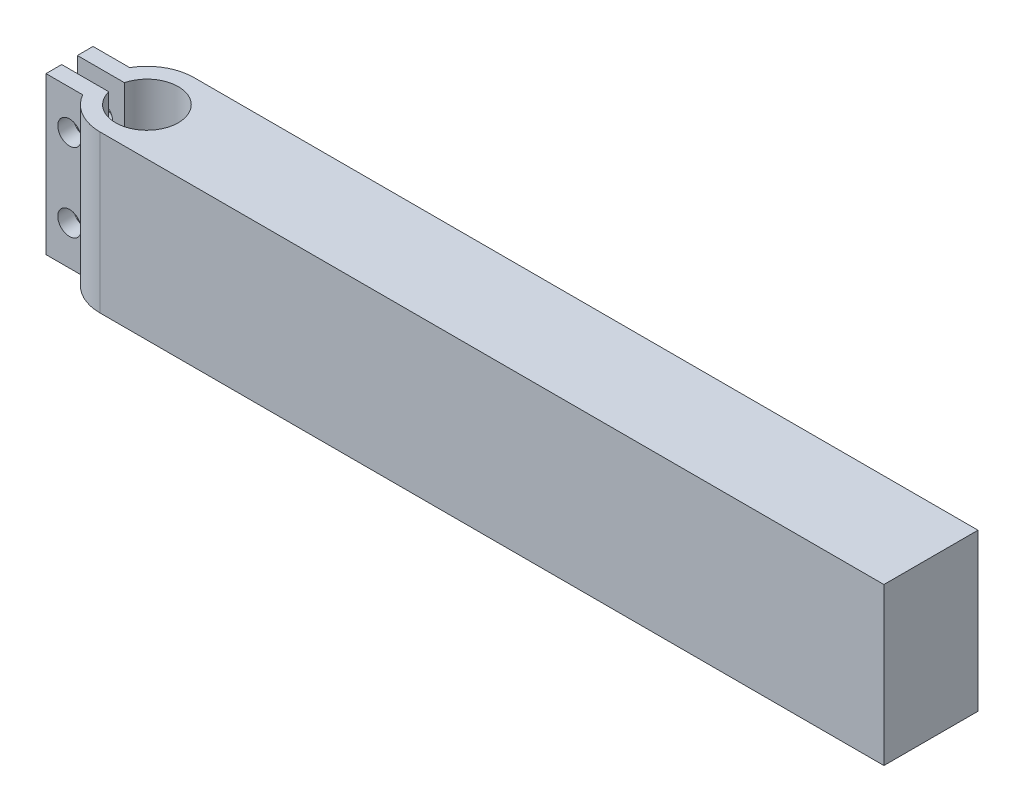
ISO-10303-21;
HEADER;
FILE_DESCRIPTION(('STEP AP214'),'2;1');
FILE_NAME('part.step','',(''),(''),'','','');
FILE_SCHEMA(('AUTOMOTIVE_DESIGN { 1 0 10303 214 1 1 1 1 }'));
ENDSEC;
DATA;
#1=APPLICATION_CONTEXT('core data for automotive mechanical design processes');
#2=APPLICATION_PROTOCOL_DEFINITION('international standard','automotive_design',2000,#1);
#3=PRODUCT_CONTEXT('',#1,'mechanical');
#4=PRODUCT('Part','Part','',(#3));
#5=PRODUCT_RELATED_PRODUCT_CATEGORY('part','',(#4));
#6=PRODUCT_DEFINITION_FORMATION('','',#4);
#7=PRODUCT_DEFINITION_CONTEXT('part definition',#1,'design');
#8=PRODUCT_DEFINITION('design','',#6,#7);
#9=PRODUCT_DEFINITION_SHAPE('','',#8);
#10=(LENGTH_UNIT() NAMED_UNIT(*) SI_UNIT(.MILLI.,.METRE.));
#11=(NAMED_UNIT(*) PLANE_ANGLE_UNIT() SI_UNIT($,.RADIAN.));
#12=(NAMED_UNIT(*) SI_UNIT($,.STERADIAN.) SOLID_ANGLE_UNIT());
#13=UNCERTAINTY_MEASURE_WITH_UNIT(LENGTH_MEASURE(1.E-05),#10,'distance_accuracy_value','');
#14=(GEOMETRIC_REPRESENTATION_CONTEXT(3) GLOBAL_UNCERTAINTY_ASSIGNED_CONTEXT((#13)) GLOBAL_UNIT_ASSIGNED_CONTEXT((#10,
#11,#12)) REPRESENTATION_CONTEXT('',''));
#15=CARTESIAN_POINT('',(0.,0.,0.));
#16=DIRECTION('',(0.,0.,1.));
#17=DIRECTION('',(1.,0.,0.));
#18=AXIS2_PLACEMENT_3D('',#15,#16,#17);
#19=CARTESIAN_POINT('',(0.,20.,-6.));
#20=DIRECTION('',(0.,-1.,0.));
#21=DIRECTION('',(0.,0.,-1.));
#22=AXIS2_PLACEMENT_3D('',#19,#20,#21);
#23=CYLINDRICAL_SURFACE('',#22,6.);
#24=CARTESIAN_POINT('',(0.,20.,-6.));
#25=DIRECTION('',(0.,1.,0.));
#26=DIRECTION('',(0.,0.,1.));
#27=AXIS2_PLACEMENT_3D('',#24,#25,#26);
#28=CIRCLE('',#27,6.);
#29=CARTESIAN_POINT('',(-5.19615242270663,20.,-3.));
#30=VERTEX_POINT('',#29);
#31=CARTESIAN_POINT('',(0.,20.,0.));
#32=VERTEX_POINT('',#31);
#33=EDGE_CURVE('E188',#30,#32,#28,.T.);
#34=ORIENTED_EDGE('',*,*,#33,.F.);
#35=DIRECTION('',(0.,-1.,0.));
#36=VECTOR('',#35,1.);
#37=CARTESIAN_POINT('',(-5.19615242270663,20.,-3.));
#38=LINE('',#37,#36);
#39=CARTESIAN_POINT('',(-5.19615242270663,0.,-3.));
#40=VERTEX_POINT('',#39);
#41=EDGE_CURVE('E153',#30,#40,#38,.T.);
#42=ORIENTED_EDGE('',*,*,#41,.T.);
#43=CARTESIAN_POINT('',(0.,0.,-6.));
#44=DIRECTION('',(0.,1.,0.));
#45=DIRECTION('',(0.,0.,1.));
#46=AXIS2_PLACEMENT_3D('',#43,#44,#45);
#47=CIRCLE('',#46,6.);
#48=CARTESIAN_POINT('',(0.,0.,0.));
#49=VERTEX_POINT('',#48);
#50=EDGE_CURVE('E200',#40,#49,#47,.T.);
#51=ORIENTED_EDGE('',*,*,#50,.T.);
#52=DIRECTION('',(0.,-1.,0.));
#53=VECTOR('',#52,1.);
#54=CARTESIAN_POINT('',(0.,20.,0.));
#55=LINE('',#54,#53);
#56=EDGE_CURVE('E212',#32,#49,#55,.T.);
#57=ORIENTED_EDGE('',*,*,#56,.F.);
#58=EDGE_LOOP('',(#34,#42,#51,#57));
#59=FACE_BOUND('',#58,.T.);
#60=ADVANCED_FACE('F35',(#59),#23,.T.);
#61=CARTESIAN_POINT('',(0.,20.,-12.));
#62=DIRECTION('',(0.,0.,-1.));
#63=DIRECTION('',(-1.,0.,0.));
#64=AXIS2_PLACEMENT_3D('',#61,#62,#63);
#65=PLANE('',#64);
#66=DIRECTION('',(1.,0.,0.));
#67=VECTOR('',#66,1.);
#68=CARTESIAN_POINT('',(0.,0.,-12.));
#69=LINE('',#68,#67);
#70=CARTESIAN_POINT('',(0.,0.,-12.));
#71=VERTEX_POINT('',#70);
#72=CARTESIAN_POINT('',(100.,0.,-12.));
#73=VERTEX_POINT('',#72);
#74=EDGE_CURVE('E182',#71,#73,#69,.T.);
#75=ORIENTED_EDGE('',*,*,#74,.F.);
#76=DIRECTION('',(0.,-1.,0.));
#77=VECTOR('',#76,1.);
#78=CARTESIAN_POINT('',(0.,20.,-12.));
#79=LINE('',#78,#77);
#80=CARTESIAN_POINT('',(0.,20.,-12.));
#81=VERTEX_POINT('',#80);
#82=EDGE_CURVE('E215',#81,#71,#79,.T.);
#83=ORIENTED_EDGE('',*,*,#82,.F.);
#84=DIRECTION('',(1.,0.,0.));
#85=VECTOR('',#84,1.);
#86=CARTESIAN_POINT('',(0.,20.,-12.));
#87=LINE('',#86,#85);
#88=CARTESIAN_POINT('',(100.,20.,-12.));
#89=VERTEX_POINT('',#88);
#90=EDGE_CURVE('E185',#81,#89,#87,.T.);
#91=ORIENTED_EDGE('',*,*,#90,.T.);
#92=DIRECTION('',(0.,-1.,0.));
#93=VECTOR('',#92,1.);
#94=CARTESIAN_POINT('',(100.,20.,-12.));
#95=LINE('',#94,#93);
#96=EDGE_CURVE('E197',#89,#73,#95,.T.);
#97=ORIENTED_EDGE('',*,*,#96,.T.);
#98=EDGE_LOOP('',(#75,#83,#91,#97));
#99=FACE_BOUND('',#98,.T.);
#100=ADVANCED_FACE('F37',(#99),#65,.T.);
#101=CARTESIAN_POINT('',(-5.19615242270663,0.,-9.));
#102=VERTEX_POINT('',#101);
#103=EDGE_CURVE('E201',#71,#102,#47,.T.);
#104=ORIENTED_EDGE('',*,*,#103,.T.);
#105=DIRECTION('',(0.,-1.,0.));
#106=VECTOR('',#105,1.);
#107=CARTESIAN_POINT('',(-5.19615242270663,20.,-9.));
#108=LINE('',#107,#106);
#109=CARTESIAN_POINT('',(-5.19615242270663,20.,-9.));
#110=VERTEX_POINT('',#109);
#111=EDGE_CURVE('E171',#102,#110,#108,.F.);
#112=ORIENTED_EDGE('',*,*,#111,.T.);
#113=EDGE_CURVE('E190',#81,#110,#28,.T.);
#114=ORIENTED_EDGE('',*,*,#113,.F.);
#115=ORIENTED_EDGE('',*,*,#82,.T.);
#116=EDGE_LOOP('',(#104,#112,#114,#115));
#117=FACE_BOUND('',#116,.T.);
#118=ADVANCED_FACE('F235',(#117),#23,.T.);
#119=CARTESIAN_POINT('',(0.,20.,0.));
#120=DIRECTION('',(0.,0.,-1.));
#121=DIRECTION('',(-1.,0.,0.));
#122=AXIS2_PLACEMENT_3D('',#119,#120,#121);
#123=PLANE('',#122);
#124=DIRECTION('',(1.,0.,0.));
#125=VECTOR('',#124,1.);
#126=CARTESIAN_POINT('',(0.,0.,0.));
#127=LINE('',#126,#125);
#128=CARTESIAN_POINT('',(100.,0.,0.));
#129=VERTEX_POINT('',#128);
#130=EDGE_CURVE('E204',#49,#129,#127,.T.);
#131=ORIENTED_EDGE('',*,*,#130,.T.);
#132=DIRECTION('',(0.,-1.,0.));
#133=VECTOR('',#132,1.);
#134=CARTESIAN_POINT('',(100.,20.,0.));
#135=LINE('',#134,#133);
#136=CARTESIAN_POINT('',(100.,20.,0.));
#137=VERTEX_POINT('',#136);
#138=EDGE_CURVE('E209',#137,#129,#135,.T.);
#139=ORIENTED_EDGE('',*,*,#138,.F.);
#140=DIRECTION('',(1.,0.,0.));
#141=VECTOR('',#140,1.);
#142=CARTESIAN_POINT('',(0.,20.,0.));
#143=LINE('',#142,#141);
#144=EDGE_CURVE('E193',#32,#137,#143,.T.);
#145=ORIENTED_EDGE('',*,*,#144,.F.);
#146=ORIENTED_EDGE('',*,*,#56,.T.);
#147=EDGE_LOOP('',(#131,#139,#145,#146));
#148=FACE_BOUND('',#147,.T.);
#149=ADVANCED_FACE('F248',(#148),#123,.F.);
#150=CARTESIAN_POINT('',(100.,20.,0.));
#151=DIRECTION('',(-1.,0.,0.));
#152=DIRECTION('',(0.,0.,1.));
#153=AXIS2_PLACEMENT_3D('',#150,#151,#152);
#154=PLANE('',#153);
#155=DIRECTION('',(0.,0.,-1.));
#156=VECTOR('',#155,1.);
#157=CARTESIAN_POINT('',(100.,0.,0.));
#158=LINE('',#157,#156);
#159=EDGE_CURVE('E189',#129,#73,#158,.T.);
#160=ORIENTED_EDGE('',*,*,#159,.T.);
#161=ORIENTED_EDGE('',*,*,#96,.F.);
#162=DIRECTION('',(0.,0.,-1.));
#163=VECTOR('',#162,1.);
#164=CARTESIAN_POINT('',(100.,20.,0.));
#165=LINE('',#164,#163);
#166=EDGE_CURVE('E195',#137,#89,#165,.T.);
#167=ORIENTED_EDGE('',*,*,#166,.F.);
#168=ORIENTED_EDGE('',*,*,#138,.T.);
#169=EDGE_LOOP('',(#160,#161,#167,#168));
#170=FACE_BOUND('',#169,.T.);
#171=ADVANCED_FACE('F243',(#170),#154,.F.);
#172=CARTESIAN_POINT('',(0.,20.,0.));
#173=DIRECTION('',(0.,1.,0.));
#174=DIRECTION('',(0.,0.,1.));
#175=AXIS2_PLACEMENT_3D('',#172,#173,#174);
#176=PLANE('',#175);
#177=CARTESIAN_POINT('',(0.,20.,-6.));
#178=DIRECTION('',(0.,1.,0.));
#179=DIRECTION('',(0.,0.,1.));
#180=AXIS2_PLACEMENT_3D('',#177,#178,#179);
#181=CIRCLE('',#180,4.);
#182=CARTESIAN_POINT('',(-3.87298334620742,20.,-5.));
#183=VERTEX_POINT('',#182);
#184=CARTESIAN_POINT('',(-3.87298334620742,20.,-7.));
#185=VERTEX_POINT('',#184);
#186=EDGE_CURVE('E131',#183,#185,#181,.T.);
#187=ORIENTED_EDGE('',*,*,#186,.F.);
#188=DIRECTION('',(1.,0.,0.));
#189=VECTOR('',#188,1.);
#190=CARTESIAN_POINT('',(-9.,20.,-5.));
#191=LINE('',#190,#189);
#192=CARTESIAN_POINT('',(-9.87298334620742,20.,-5.));
#193=VERTEX_POINT('',#192);
#194=EDGE_CURVE('E58',#193,#183,#191,.T.);
#195=ORIENTED_EDGE('',*,*,#194,.F.);
#196=DIRECTION('',(0.,0.,1.));
#197=VECTOR('',#196,1.);
#198=CARTESIAN_POINT('',(-9.87298334620742,20.,-5.));
#199=LINE('',#198,#197);
#200=CARTESIAN_POINT('',(-9.87298334620742,20.,-3.));
#201=VERTEX_POINT('',#200);
#202=EDGE_CURVE('E139',#193,#201,#199,.T.);
#203=ORIENTED_EDGE('',*,*,#202,.T.);
#204=DIRECTION('',(1.,0.,0.));
#205=VECTOR('',#204,1.);
#206=CARTESIAN_POINT('',(-3.87298334620742,20.,-3.));
#207=LINE('',#206,#205);
#208=EDGE_CURVE('E50',#201,#30,#207,.T.);
#209=ORIENTED_EDGE('',*,*,#208,.T.);
#210=ORIENTED_EDGE('',*,*,#33,.T.);
#211=ORIENTED_EDGE('',*,*,#144,.T.);
#212=ORIENTED_EDGE('',*,*,#166,.T.);
#213=ORIENTED_EDGE('',*,*,#90,.F.);
#214=ORIENTED_EDGE('',*,*,#113,.T.);
#215=DIRECTION('',(-1.,0.,0.));
#216=VECTOR('',#215,1.);
#217=CARTESIAN_POINT('',(-3.87298334620742,20.,-9.));
#218=LINE('',#217,#216);
#219=CARTESIAN_POINT('',(-9.87298334620742,20.,-9.));
#220=VERTEX_POINT('',#219);
#221=EDGE_CURVE('E157',#110,#220,#218,.T.);
#222=ORIENTED_EDGE('',*,*,#221,.T.);
#223=DIRECTION('',(0.,0.,1.));
#224=VECTOR('',#223,1.);
#225=CARTESIAN_POINT('',(-9.87298334620742,20.,-7.));
#226=LINE('',#225,#224);
#227=CARTESIAN_POINT('',(-9.87298334620742,20.,-7.));
#228=VERTEX_POINT('',#227);
#229=EDGE_CURVE('E161',#220,#228,#226,.T.);
#230=ORIENTED_EDGE('',*,*,#229,.T.);
#231=DIRECTION('',(-1.,0.,0.));
#232=VECTOR('',#231,1.);
#233=CARTESIAN_POINT('',(-9.,20.,-7.));
#234=LINE('',#233,#232);
#235=EDGE_CURVE('E176',#185,#228,#234,.T.);
#236=ORIENTED_EDGE('',*,*,#235,.F.);
#237=EDGE_LOOP('',(#187,#195,#203,#209,#210,#211,#212,#213,#214,#222,#230,#236));
#238=FACE_BOUND('',#237,.T.);
#239=ADVANCED_FACE('F254',(#238),#176,.T.);
#240=CARTESIAN_POINT('',(0.,0.,0.));
#241=DIRECTION('',(0.,1.,0.));
#242=DIRECTION('',(0.,0.,1.));
#243=AXIS2_PLACEMENT_3D('',#240,#241,#242);
#244=PLANE('',#243);
#245=DIRECTION('',(1.,0.,0.));
#246=VECTOR('',#245,1.);
#247=CARTESIAN_POINT('',(-9.,0.,-5.));
#248=LINE('',#247,#246);
#249=CARTESIAN_POINT('',(-9.87298334620742,0.,-5.));
#250=VERTEX_POINT('',#249);
#251=CARTESIAN_POINT('',(-3.87298334620742,0.,-5.));
#252=VERTEX_POINT('',#251);
#253=EDGE_CURVE('E122',#250,#252,#248,.T.);
#254=ORIENTED_EDGE('',*,*,#253,.T.);
#255=CARTESIAN_POINT('',(0.,0.,-6.));
#256=DIRECTION('',(0.,1.,0.));
#257=DIRECTION('',(0.,0.,1.));
#258=AXIS2_PLACEMENT_3D('',#255,#256,#257);
#259=CIRCLE('',#258,4.);
#260=CARTESIAN_POINT('',(-3.87298334620742,0.,-7.));
#261=VERTEX_POINT('',#260);
#262=EDGE_CURVE('E180',#252,#261,#259,.T.);
#263=ORIENTED_EDGE('',*,*,#262,.T.);
#264=DIRECTION('',(-1.,0.,0.));
#265=VECTOR('',#264,1.);
#266=CARTESIAN_POINT('',(-9.,0.,-7.));
#267=LINE('',#266,#265);
#268=CARTESIAN_POINT('',(-9.87298334620742,0.,-7.));
#269=VERTEX_POINT('',#268);
#270=EDGE_CURVE('E132',#261,#269,#267,.T.);
#271=ORIENTED_EDGE('',*,*,#270,.T.);
#272=DIRECTION('',(0.,0.,1.));
#273=VECTOR('',#272,1.);
#274=CARTESIAN_POINT('',(-9.87298334620742,0.,-7.));
#275=LINE('',#274,#273);
#276=CARTESIAN_POINT('',(-9.87298334620742,0.,-9.));
#277=VERTEX_POINT('',#276);
#278=EDGE_CURVE('E160',#277,#269,#275,.T.);
#279=ORIENTED_EDGE('',*,*,#278,.F.);
#280=DIRECTION('',(-1.,0.,0.));
#281=VECTOR('',#280,1.);
#282=CARTESIAN_POINT('',(-3.87298334620742,0.,-9.));
#283=LINE('',#282,#281);
#284=EDGE_CURVE('E158',#102,#277,#283,.T.);
#285=ORIENTED_EDGE('',*,*,#284,.F.);
#286=ORIENTED_EDGE('',*,*,#103,.F.);
#287=ORIENTED_EDGE('',*,*,#74,.T.);
#288=ORIENTED_EDGE('',*,*,#159,.F.);
#289=ORIENTED_EDGE('',*,*,#130,.F.);
#290=ORIENTED_EDGE('',*,*,#50,.F.);
#291=DIRECTION('',(1.,0.,0.));
#292=VECTOR('',#291,1.);
#293=CARTESIAN_POINT('',(-3.87298334620742,0.,-3.));
#294=LINE('',#293,#292);
#295=CARTESIAN_POINT('',(-9.87298334620742,0.,-3.));
#296=VERTEX_POINT('',#295);
#297=EDGE_CURVE('E141',#296,#40,#294,.T.);
#298=ORIENTED_EDGE('',*,*,#297,.F.);
#299=DIRECTION('',(0.,0.,1.));
#300=VECTOR('',#299,1.);
#301=CARTESIAN_POINT('',(-9.87298334620742,0.,-5.));
#302=LINE('',#301,#300);
#303=EDGE_CURVE('E137',#250,#296,#302,.T.);
#304=ORIENTED_EDGE('',*,*,#303,.F.);
#305=EDGE_LOOP('',(#254,#263,#271,#279,#285,#286,#287,#288,#289,#290,#298,#304));
#306=FACE_BOUND('',#305,.T.);
#307=ADVANCED_FACE('F143',(#306),#244,.F.);
#308=CARTESIAN_POINT('',(0.,0.,-6.));
#309=DIRECTION('',(0.,1.,0.));
#310=DIRECTION('',(0.,0.,1.));
#311=AXIS2_PLACEMENT_3D('',#308,#309,#310);
#312=CYLINDRICAL_SURFACE('',#311,4.);
#313=ORIENTED_EDGE('',*,*,#262,.F.);
#314=DIRECTION('',(0.,1.,0.));
#315=VECTOR('',#314,1.);
#316=CARTESIAN_POINT('',(-3.87298334620742,0.,-5.));
#317=LINE('',#316,#315);
#318=EDGE_CURVE('E11',#252,#183,#317,.T.);
#319=ORIENTED_EDGE('',*,*,#318,.T.);
#320=ORIENTED_EDGE('',*,*,#186,.T.);
#321=DIRECTION('',(0.,1.,0.));
#322=VECTOR('',#321,1.);
#323=CARTESIAN_POINT('',(-3.87298334620742,0.,-7.));
#324=LINE('',#323,#322);
#325=EDGE_CURVE('E43',#185,#261,#324,.F.);
#326=ORIENTED_EDGE('',*,*,#325,.T.);
#327=EDGE_LOOP('',(#313,#319,#320,#326));
#328=FACE_BOUND('',#327,.T.);
#329=ADVANCED_FACE('F218',(#328),#312,.F.);
#330=CARTESIAN_POINT('',(-9.,0.,-7.));
#331=DIRECTION('',(0.,0.,-1.));
#332=DIRECTION('',(-1.,0.,0.));
#333=AXIS2_PLACEMENT_3D('',#330,#331,#332);
#334=PLANE('',#333);
#335=CARTESIAN_POINT('',(-6.87298334620742,5.,-7.));
#336=DIRECTION('',(0.,0.,-1.));
#337=DIRECTION('',(-1.,0.,0.));
#338=AXIS2_PLACEMENT_3D('',#335,#336,#337);
#339=CIRCLE('',#338,1.5);
#340=CARTESIAN_POINT('',(-8.37298334620742,5.,-7.));
#341=VERTEX_POINT('',#340);
#342=EDGE_CURVE('E412',#341,#341,#339,.T.);
#343=ORIENTED_EDGE('',*,*,#342,.T.);
#344=EDGE_LOOP('',(#343));
#345=FACE_BOUND('',#344,.T.);
#346=CARTESIAN_POINT('',(-6.87298334620742,15.,-7.));
#347=DIRECTION('',(0.,0.,-1.));
#348=DIRECTION('',(-1.,0.,0.));
#349=AXIS2_PLACEMENT_3D('',#346,#347,#348);
#350=CIRCLE('',#349,1.5);
#351=CARTESIAN_POINT('',(-8.37298334620742,15.,-7.));
#352=VERTEX_POINT('',#351);
#353=EDGE_CURVE('E149',#352,#352,#350,.T.);
#354=ORIENTED_EDGE('',*,*,#353,.T.);
#355=EDGE_LOOP('',(#354));
#356=FACE_BOUND('',#355,.T.);
#357=ORIENTED_EDGE('',*,*,#270,.F.);
#358=ORIENTED_EDGE('',*,*,#325,.F.);
#359=ORIENTED_EDGE('',*,*,#235,.T.);
#360=DIRECTION('',(0.,1.,0.));
#361=VECTOR('',#360,1.);
#362=CARTESIAN_POINT('',(-9.87298334620742,0.,-7.));
#363=LINE('',#362,#361);
#364=EDGE_CURVE('E168',#269,#228,#363,.T.);
#365=ORIENTED_EDGE('',*,*,#364,.F.);
#366=EDGE_LOOP('',(#357,#358,#359,#365));
#367=FACE_BOUND('',#366,.T.);
#368=ADVANCED_FACE('F225',(#345,#356,#367),#334,.F.);
#369=CARTESIAN_POINT('',(-9.,0.,-5.));
#370=DIRECTION('',(0.,0.,1.));
#371=DIRECTION('',(1.,0.,0.));
#372=AXIS2_PLACEMENT_3D('',#369,#370,#371);
#373=PLANE('',#372);
#374=CARTESIAN_POINT('',(-6.87298334620742,5.,-5.));
#375=DIRECTION('',(0.,0.,1.));
#376=DIRECTION('',(1.,0.,0.));
#377=AXIS2_PLACEMENT_3D('',#374,#375,#376);
#378=CIRCLE('',#377,1.5);
#379=CARTESIAN_POINT('',(-5.37298334620742,5.,-5.));
#380=VERTEX_POINT('',#379);
#381=EDGE_CURVE('E414',#380,#380,#378,.T.);
#382=ORIENTED_EDGE('',*,*,#381,.T.);
#383=EDGE_LOOP('',(#382));
#384=FACE_BOUND('',#383,.T.);
#385=CARTESIAN_POINT('',(-6.87298334620742,15.,-5.));
#386=DIRECTION('',(0.,0.,1.));
#387=DIRECTION('',(1.,0.,0.));
#388=AXIS2_PLACEMENT_3D('',#385,#386,#387);
#389=CIRCLE('',#388,1.5);
#390=CARTESIAN_POINT('',(-5.37298334620742,15.,-5.));
#391=VERTEX_POINT('',#390);
#392=EDGE_CURVE('E424',#391,#391,#389,.T.);
#393=ORIENTED_EDGE('',*,*,#392,.T.);
#394=EDGE_LOOP('',(#393));
#395=FACE_BOUND('',#394,.T.);
#396=ORIENTED_EDGE('',*,*,#194,.T.);
#397=ORIENTED_EDGE('',*,*,#318,.F.);
#398=ORIENTED_EDGE('',*,*,#253,.F.);
#399=DIRECTION('',(0.,1.,0.));
#400=VECTOR('',#399,1.);
#401=CARTESIAN_POINT('',(-9.87298334620742,0.,-5.));
#402=LINE('',#401,#400);
#403=EDGE_CURVE('E125',#250,#193,#402,.T.);
#404=ORIENTED_EDGE('',*,*,#403,.T.);
#405=EDGE_LOOP('',(#396,#397,#398,#404));
#406=FACE_BOUND('',#405,.T.);
#407=ADVANCED_FACE('F124',(#384,#395,#406),#373,.F.);
#408=CARTESIAN_POINT('',(-3.87298334620742,0.,-9.));
#409=DIRECTION('',(0.,0.,-1.));
#410=DIRECTION('',(-1.,0.,0.));
#411=AXIS2_PLACEMENT_3D('',#408,#409,#410);
#412=PLANE('',#411);
#413=CARTESIAN_POINT('',(-6.87298334620742,5.,-9.));
#414=DIRECTION('',(0.,0.,-1.));
#415=DIRECTION('',(-1.,0.,0.));
#416=AXIS2_PLACEMENT_3D('',#413,#414,#415);
#417=CIRCLE('',#416,1.5);
#418=CARTESIAN_POINT('',(-8.37298334620742,5.,-9.));
#419=VERTEX_POINT('',#418);
#420=EDGE_CURVE('E409',#419,#419,#417,.T.);
#421=ORIENTED_EDGE('',*,*,#420,.F.);
#422=EDGE_LOOP('',(#421));
#423=FACE_BOUND('',#422,.T.);
#424=CARTESIAN_POINT('',(-6.87298334620742,15.,-9.));
#425=DIRECTION('',(0.,0.,-1.));
#426=DIRECTION('',(-1.,0.,0.));
#427=AXIS2_PLACEMENT_3D('',#424,#425,#426);
#428=CIRCLE('',#427,1.5);
#429=CARTESIAN_POINT('',(-8.37298334620742,15.,-9.));
#430=VERTEX_POINT('',#429);
#431=EDGE_CURVE('E417',#430,#430,#428,.T.);
#432=ORIENTED_EDGE('',*,*,#431,.F.);
#433=EDGE_LOOP('',(#432));
#434=FACE_BOUND('',#433,.T.);
#435=ORIENTED_EDGE('',*,*,#111,.F.);
#436=ORIENTED_EDGE('',*,*,#284,.T.);
#437=DIRECTION('',(0.,1.,0.));
#438=VECTOR('',#437,1.);
#439=CARTESIAN_POINT('',(-9.87298334620742,0.,-9.));
#440=LINE('',#439,#438);
#441=EDGE_CURVE('E164',#277,#220,#440,.T.);
#442=ORIENTED_EDGE('',*,*,#441,.T.);
#443=ORIENTED_EDGE('',*,*,#221,.F.);
#444=EDGE_LOOP('',(#435,#436,#442,#443));
#445=FACE_BOUND('',#444,.T.);
#446=ADVANCED_FACE('F231',(#423,#434,#445),#412,.T.);
#447=CARTESIAN_POINT('',(-9.87298334620742,0.,-7.));
#448=DIRECTION('',(-1.,0.,0.));
#449=DIRECTION('',(0.,0.,1.));
#450=AXIS2_PLACEMENT_3D('',#447,#448,#449);
#451=PLANE('',#450);
#452=ORIENTED_EDGE('',*,*,#229,.F.);
#453=ORIENTED_EDGE('',*,*,#441,.F.);
#454=ORIENTED_EDGE('',*,*,#278,.T.);
#455=ORIENTED_EDGE('',*,*,#364,.T.);
#456=EDGE_LOOP('',(#452,#453,#454,#455));
#457=FACE_BOUND('',#456,.T.);
#458=ADVANCED_FACE('F229',(#457),#451,.T.);
#459=CARTESIAN_POINT('',(-3.87298334620742,0.,-3.));
#460=DIRECTION('',(0.,0.,1.));
#461=DIRECTION('',(1.,0.,0.));
#462=AXIS2_PLACEMENT_3D('',#459,#460,#461);
#463=PLANE('',#462);
#464=CARTESIAN_POINT('',(-6.87298334620742,5.,-3.));
#465=DIRECTION('',(0.,0.,1.));
#466=DIRECTION('',(1.,0.,0.));
#467=AXIS2_PLACEMENT_3D('',#464,#465,#466);
#468=CIRCLE('',#467,1.5);
#469=CARTESIAN_POINT('',(-5.37298334620742,5.,-3.));
#470=VERTEX_POINT('',#469);
#471=EDGE_CURVE('E436',#470,#470,#468,.T.);
#472=ORIENTED_EDGE('',*,*,#471,.F.);
#473=EDGE_LOOP('',(#472));
#474=FACE_BOUND('',#473,.T.);
#475=CARTESIAN_POINT('',(-6.87298334620742,15.,-3.));
#476=DIRECTION('',(0.,0.,1.));
#477=DIRECTION('',(1.,0.,0.));
#478=AXIS2_PLACEMENT_3D('',#475,#476,#477);
#479=CIRCLE('',#478,1.5);
#480=CARTESIAN_POINT('',(-5.37298334620742,15.,-3.));
#481=VERTEX_POINT('',#480);
#482=EDGE_CURVE('E413',#481,#481,#479,.T.);
#483=ORIENTED_EDGE('',*,*,#482,.F.);
#484=EDGE_LOOP('',(#483));
#485=FACE_BOUND('',#484,.T.);
#486=ORIENTED_EDGE('',*,*,#41,.F.);
#487=ORIENTED_EDGE('',*,*,#208,.F.);
#488=DIRECTION('',(0.,1.,0.));
#489=VECTOR('',#488,1.);
#490=CARTESIAN_POINT('',(-9.87298334620742,0.,-3.));
#491=LINE('',#490,#489);
#492=EDGE_CURVE('E140',#296,#201,#491,.T.);
#493=ORIENTED_EDGE('',*,*,#492,.F.);
#494=ORIENTED_EDGE('',*,*,#297,.T.);
#495=EDGE_LOOP('',(#486,#487,#493,#494));
#496=FACE_BOUND('',#495,.T.);
#497=ADVANCED_FACE('F253',(#474,#485,#496),#463,.T.);
#498=CARTESIAN_POINT('',(-9.87298334620742,0.,-5.));
#499=DIRECTION('',(-1.,0.,0.));
#500=DIRECTION('',(0.,0.,1.));
#501=AXIS2_PLACEMENT_3D('',#498,#499,#500);
#502=PLANE('',#501);
#503=ORIENTED_EDGE('',*,*,#202,.F.);
#504=ORIENTED_EDGE('',*,*,#403,.F.);
#505=ORIENTED_EDGE('',*,*,#303,.T.);
#506=ORIENTED_EDGE('',*,*,#492,.T.);
#507=EDGE_LOOP('',(#503,#504,#505,#506));
#508=FACE_BOUND('',#507,.T.);
#509=ADVANCED_FACE('F136',(#508),#502,.T.);
#510=CARTESIAN_POINT('',(-6.87298334620742,15.,-23.));
#511=DIRECTION('',(0.,0.,1.));
#512=DIRECTION('',(1.,0.,0.));
#513=AXIS2_PLACEMENT_3D('',#510,#511,#512);
#514=CYLINDRICAL_SURFACE('',#513,1.5);
#515=ORIENTED_EDGE('',*,*,#482,.T.);
#516=EDGE_LOOP('',(#515));
#517=FACE_BOUND('',#516,.T.);
#518=ORIENTED_EDGE('',*,*,#392,.F.);
#519=EDGE_LOOP('',(#518));
#520=FACE_BOUND('',#519,.T.);
#521=ADVANCED_FACE('F334',(#517,#520),#514,.F.);
#522=ORIENTED_EDGE('',*,*,#431,.T.);
#523=EDGE_LOOP('',(#522));
#524=FACE_BOUND('',#523,.T.);
#525=ORIENTED_EDGE('',*,*,#353,.F.);
#526=EDGE_LOOP('',(#525));
#527=FACE_BOUND('',#526,.T.);
#528=ADVANCED_FACE('F374',(#524,#527),#514,.F.);
#529=CARTESIAN_POINT('',(-6.87298334620742,5.,-23.));
#530=DIRECTION('',(0.,0.,1.));
#531=DIRECTION('',(1.,0.,0.));
#532=AXIS2_PLACEMENT_3D('',#529,#530,#531);
#533=CYLINDRICAL_SURFACE('',#532,1.5);
#534=ORIENTED_EDGE('',*,*,#471,.T.);
#535=EDGE_LOOP('',(#534));
#536=FACE_BOUND('',#535,.T.);
#537=ORIENTED_EDGE('',*,*,#381,.F.);
#538=EDGE_LOOP('',(#537));
#539=FACE_BOUND('',#538,.T.);
#540=ADVANCED_FACE('F384',(#536,#539),#533,.F.);
#541=ORIENTED_EDGE('',*,*,#420,.T.);
#542=EDGE_LOOP('',(#541));
#543=FACE_BOUND('',#542,.T.);
#544=ORIENTED_EDGE('',*,*,#342,.F.);
#545=EDGE_LOOP('',(#544));
#546=FACE_BOUND('',#545,.T.);
#547=ADVANCED_FACE('F393',(#543,#546),#533,.F.);
#548=CLOSED_SHELL('',(#60,#100,#118,#149,#171,#239,#307,#329,#368,#407,#446,#458,#497,#509,#521,
#528,#540,#547));
#549=MANIFOLD_SOLID_BREP('B2',#548);
#550=ADVANCED_BREP_SHAPE_REPRESENTATION('',(#18,#549),#14);
#551=SHAPE_DEFINITION_REPRESENTATION(#9,#550);
ENDSEC;
END-ISO-10303-21;
